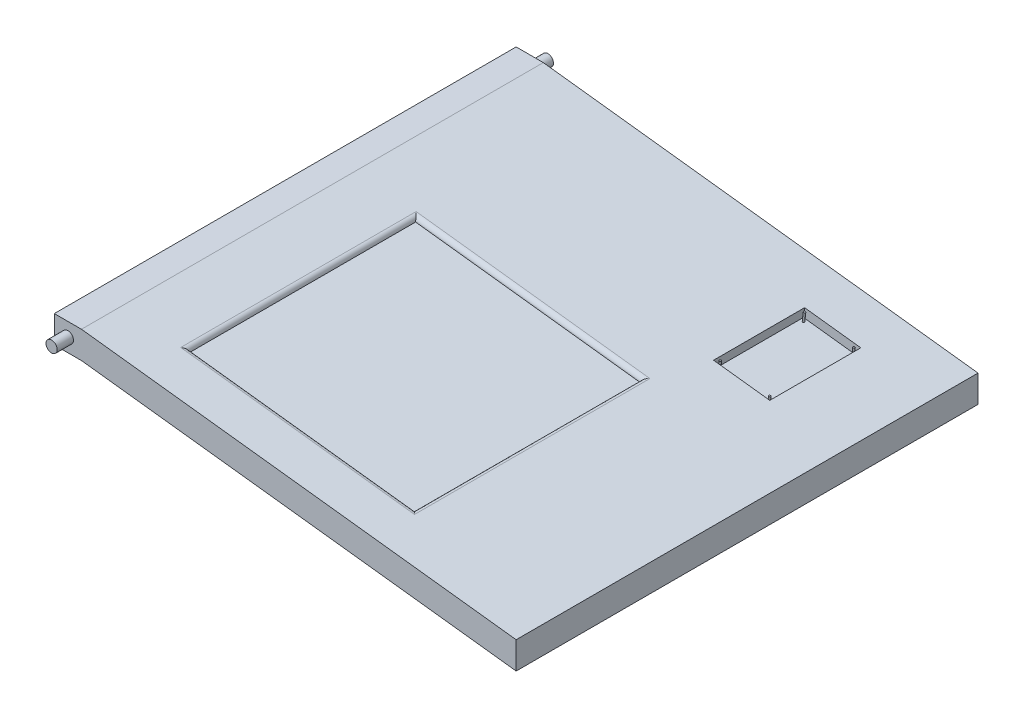
ISO-10303-21;
HEADER;
FILE_DESCRIPTION(('STEP AP214'),'2;1');
FILE_NAME('part.step','',(''),(''),'','','');
FILE_SCHEMA(('AUTOMOTIVE_DESIGN { 1 0 10303 214 1 1 1 1 }'));
ENDSEC;
DATA;
#1=APPLICATION_CONTEXT('core data for automotive mechanical design processes');
#2=APPLICATION_PROTOCOL_DEFINITION('international standard','automotive_design',2000,#1);
#3=PRODUCT_CONTEXT('',#1,'mechanical');
#4=PRODUCT('Part','Part','',(#3));
#5=PRODUCT_RELATED_PRODUCT_CATEGORY('part','',(#4));
#6=PRODUCT_DEFINITION_FORMATION('','',#4);
#7=PRODUCT_DEFINITION_CONTEXT('part definition',#1,'design');
#8=PRODUCT_DEFINITION('design','',#6,#7);
#9=PRODUCT_DEFINITION_SHAPE('','',#8);
#10=(LENGTH_UNIT() NAMED_UNIT(*) SI_UNIT(.MILLI.,.METRE.));
#11=(NAMED_UNIT(*) PLANE_ANGLE_UNIT() SI_UNIT($,.RADIAN.));
#12=(NAMED_UNIT(*) SI_UNIT($,.STERADIAN.) SOLID_ANGLE_UNIT());
#13=UNCERTAINTY_MEASURE_WITH_UNIT(LENGTH_MEASURE(1.E-05),#10,'distance_accuracy_value','');
#14=(GEOMETRIC_REPRESENTATION_CONTEXT(3) GLOBAL_UNCERTAINTY_ASSIGNED_CONTEXT((#13)) GLOBAL_UNIT_ASSIGNED_CONTEXT((#10,
#11,#12)) REPRESENTATION_CONTEXT('',''));
#15=CARTESIAN_POINT('',(0.,0.,0.));
#16=DIRECTION('',(0.,0.,1.));
#17=DIRECTION('',(1.,0.,0.));
#18=AXIS2_PLACEMENT_3D('',#15,#16,#17);
#19=CARTESIAN_POINT('',(-50.6671987968214,85.1607173842718,-20.));
#20=DIRECTION('',(0.,0.,1.));
#21=DIRECTION('',(1.,0.,0.));
#22=AXIS2_PLACEMENT_3D('',#19,#20,#21);
#23=CYLINDRICAL_SURFACE('',#22,6.18185615396312);
#24=CARTESIAN_POINT('',(-50.6671987968214,85.1607173842718,-20.));
#25=DIRECTION('',(0.,0.,-1.));
#26=DIRECTION('',(-1.,0.,0.));
#27=AXIS2_PLACEMENT_3D('',#24,#25,#26);
#28=CIRCLE('',#27,6.18185615396312);
#29=CARTESIAN_POINT('',(-56.8490549507845,85.1607173842718,-20.));
#30=VERTEX_POINT('',#29);
#31=EDGE_CURVE('E11',#30,#30,#28,.T.);
#32=ORIENTED_EDGE('',*,*,#31,.F.);
#33=EDGE_LOOP('',(#32));
#34=FACE_BOUND('',#33,.T.);
#35=CARTESIAN_POINT('',(-50.6671987968214,85.1607173842718,0.));
#36=DIRECTION('',(0.,0.,-1.));
#37=DIRECTION('',(-1.,0.,0.));
#38=AXIS2_PLACEMENT_3D('',#35,#36,#37);
#39=CIRCLE('',#38,6.18185615396312);
#40=CARTESIAN_POINT('',(-56.8490549507845,85.1607173842718,0.));
#41=VERTEX_POINT('',#40);
#42=EDGE_CURVE('E45',#41,#41,#39,.T.);
#43=ORIENTED_EDGE('',*,*,#42,.T.);
#44=EDGE_LOOP('',(#43));
#45=FACE_BOUND('',#44,.T.);
#46=ADVANCED_FACE('F42',(#34,#45),#23,.T.);
#47=CARTESIAN_POINT('',(-50.6671987968214,85.1607173842718,-20.));
#48=DIRECTION('',(0.,0.,-1.));
#49=DIRECTION('',(-1.,0.,0.));
#50=AXIS2_PLACEMENT_3D('',#47,#48,#49);
#51=PLANE('',#50);
#52=ORIENTED_EDGE('',*,*,#31,.T.);
#53=EDGE_LOOP('',(#52));
#54=FACE_BOUND('',#53,.T.);
#55=ADVANCED_FACE('F57',(#54),#51,.T.);
#56=CARTESIAN_POINT('',(-50.6671987968214,85.1607173842718,0.));
#57=DIRECTION('',(0.,0.,-1.));
#58=DIRECTION('',(-1.,0.,0.));
#59=AXIS2_PLACEMENT_3D('',#56,#57,#58);
#60=PLANE('',#59);
#61=ORIENTED_EDGE('',*,*,#42,.F.);
#62=EDGE_LOOP('',(#61));
#63=FACE_BOUND('',#62,.T.);
#64=ADVANCED_FACE('F55',(#63),#60,.F.);
#65=CLOSED_SHELL('',(#46,#55,#64));
#66=MANIFOLD_SOLID_BREP('B2',#65);
#67=CARTESIAN_POINT('',(-50.6671987968214,85.1607173842718,510.));
#68=DIRECTION('',(0.,0.,-1.));
#69=DIRECTION('',(-1.,0.,0.));
#70=AXIS2_PLACEMENT_3D('',#67,#68,#69);
#71=CYLINDRICAL_SURFACE('',#70,6.18185615396314);
#72=CARTESIAN_POINT('',(-50.6671987968214,85.1607173842718,0.));
#73=DIRECTION('',(0.,0.,1.));
#74=DIRECTION('',(1.,0.,0.));
#75=AXIS2_PLACEMENT_3D('',#72,#73,#74);
#76=CIRCLE('',#75,6.18185615396314);
#77=CARTESIAN_POINT('',(-44.4853426428583,85.1607173842718,0.));
#78=VERTEX_POINT('',#77);
#79=EDGE_CURVE('E291',#78,#78,#76,.T.);
#80=ORIENTED_EDGE('',*,*,#79,.F.);
#81=EDGE_LOOP('',(#80));
#82=FACE_BOUND('',#81,.T.);
#83=CARTESIAN_POINT('',(-50.6671987968214,85.1607173842718,39.));
#84=DIRECTION('',(0.,0.,1.));
#85=DIRECTION('',(1.,0.,0.));
#86=AXIS2_PLACEMENT_3D('',#83,#84,#85);
#87=CIRCLE('',#86,6.18185615396313);
#88=CARTESIAN_POINT('',(-44.4853426428583,85.1607173842718,39.));
#89=VERTEX_POINT('',#88);
#90=EDGE_CURVE('E279',#89,#89,#87,.T.);
#91=ORIENTED_EDGE('',*,*,#90,.T.);
#92=EDGE_LOOP('',(#91));
#93=FACE_BOUND('',#92,.T.);
#94=ADVANCED_FACE('F82',(#82,#93),#71,.F.);
#95=CARTESIAN_POINT('',(0.,0.,510.));
#96=DIRECTION('',(0.,0.,1.));
#97=DIRECTION('',(1.,0.,0.));
#98=AXIS2_PLACEMENT_3D('',#95,#96,#97);
#99=PLANE('',#98);
#100=DIRECTION('',(-1.,0.,0.));
#101=VECTOR('',#100,1.);
#102=CARTESIAN_POINT('',(-35.6671987968214,100.160717384272,510.));
#103=LINE('',#102,#101);
#104=CARTESIAN_POINT('',(-35.6671987968214,100.160717384272,510.));
#105=VERTEX_POINT('',#104);
#106=CARTESIAN_POINT('',(-65.6671987968214,100.160717384272,510.));
#107=VERTEX_POINT('',#106);
#108=EDGE_CURVE('E298',#105,#107,#103,.T.);
#109=ORIENTED_EDGE('',*,*,#108,.T.);
#110=DIRECTION('',(0.,-1.,0.));
#111=VECTOR('',#110,1.);
#112=CARTESIAN_POINT('',(-65.6671987968214,100.160717384272,510.));
#113=LINE('',#112,#111);
#114=CARTESIAN_POINT('',(-65.6671987968214,70.1607173842718,510.));
#115=VERTEX_POINT('',#114);
#116=EDGE_CURVE('E301',#107,#115,#113,.T.);
#117=ORIENTED_EDGE('',*,*,#116,.T.);
#118=DIRECTION('',(1.,0.,0.));
#119=VECTOR('',#118,1.);
#120=CARTESIAN_POINT('',(-65.6671987968214,70.1607173842718,510.));
#121=LINE('',#120,#119);
#122=CARTESIAN_POINT('',(-35.6671987968214,70.1607173842718,510.));
#123=VERTEX_POINT('',#122);
#124=EDGE_CURVE('E304',#115,#123,#121,.T.);
#125=ORIENTED_EDGE('',*,*,#124,.T.);
#126=DIRECTION('',(0.993047201905513,-0.117716841563267,0.));
#127=VECTOR('',#126,1.);
#128=CARTESIAN_POINT('',(-35.6671987968214,70.1607173842718,510.));
#129=LINE('',#128,#127);
#130=CARTESIAN_POINT('',(444.332801203179,13.2610213356398,510.));
#131=VERTEX_POINT('',#130);
#132=EDGE_CURVE('E306',#123,#131,#129,.T.);
#133=ORIENTED_EDGE('',*,*,#132,.T.);
#134=DIRECTION('',(0.,1.,0.));
#135=VECTOR('',#134,1.);
#136=CARTESIAN_POINT('',(444.332801203179,13.2610213356398,510.));
#137=LINE('',#136,#135);
#138=CARTESIAN_POINT('',(444.332801203179,43.2610213356398,510.));
#139=VERTEX_POINT('',#138);
#140=EDGE_CURVE('E308',#131,#139,#137,.T.);
#141=ORIENTED_EDGE('',*,*,#140,.T.);
#142=DIRECTION('',(-0.993047201905513,0.117716841563267,0.));
#143=VECTOR('',#142,1.);
#144=CARTESIAN_POINT('',(444.332801203179,43.2610213356398,510.));
#145=LINE('',#144,#143);
#146=EDGE_CURVE('E310',#139,#105,#145,.T.);
#147=ORIENTED_EDGE('',*,*,#146,.T.);
#148=EDGE_LOOP('',(#109,#117,#125,#133,#141,#147));
#149=FACE_BOUND('',#148,.T.);
#150=CARTESIAN_POINT('',(-50.6671987968214,85.1607173842718,510.));
#151=DIRECTION('',(0.,0.,1.));
#152=DIRECTION('',(1.,0.,0.));
#153=AXIS2_PLACEMENT_3D('',#150,#151,#152);
#154=CIRCLE('',#153,6.18185615396314);
#155=CARTESIAN_POINT('',(-44.4853426428583,85.1607173842718,510.));
#156=VERTEX_POINT('',#155);
#157=EDGE_CURVE('E292',#156,#156,#154,.T.);
#158=ORIENTED_EDGE('',*,*,#157,.F.);
#159=EDGE_LOOP('',(#158));
#160=FACE_BOUND('',#159,.T.);
#161=ADVANCED_FACE('F390',(#149,#160),#99,.T.);
#162=CARTESIAN_POINT('',(0.,0.,0.));
#163=DIRECTION('',(0.,0.,1.));
#164=DIRECTION('',(1.,0.,0.));
#165=AXIS2_PLACEMENT_3D('',#162,#163,#164);
#166=PLANE('',#165);
#167=DIRECTION('',(-1.,0.,0.));
#168=VECTOR('',#167,1.);
#169=CARTESIAN_POINT('',(-35.6671987968214,100.160717384272,0.));
#170=LINE('',#169,#168);
#171=CARTESIAN_POINT('',(-35.6671987968214,100.160717384272,0.));
#172=VERTEX_POINT('',#171);
#173=CARTESIAN_POINT('',(-65.6671987968214,100.160717384272,0.));
#174=VERTEX_POINT('',#173);
#175=EDGE_CURVE('E295',#172,#174,#170,.T.);
#176=ORIENTED_EDGE('',*,*,#175,.F.);
#177=DIRECTION('',(-0.993047201905513,0.117716841563267,0.));
#178=VECTOR('',#177,1.);
#179=CARTESIAN_POINT('',(444.332801203179,43.2610213356398,0.));
#180=LINE('',#179,#178);
#181=CARTESIAN_POINT('',(444.332801203179,43.2610213356398,0.));
#182=VERTEX_POINT('',#181);
#183=EDGE_CURVE('E302',#182,#172,#180,.T.);
#184=ORIENTED_EDGE('',*,*,#183,.F.);
#185=DIRECTION('',(0.,1.,0.));
#186=VECTOR('',#185,1.);
#187=CARTESIAN_POINT('',(444.332801203179,13.2610213356398,0.));
#188=LINE('',#187,#186);
#189=CARTESIAN_POINT('',(444.332801203179,13.2610213356398,0.));
#190=VERTEX_POINT('',#189);
#191=EDGE_CURVE('E321',#190,#182,#188,.T.);
#192=ORIENTED_EDGE('',*,*,#191,.F.);
#193=DIRECTION('',(0.993047201905513,-0.117716841563267,0.));
#194=VECTOR('',#193,1.);
#195=CARTESIAN_POINT('',(-35.6671987968214,70.1607173842718,0.));
#196=LINE('',#195,#194);
#197=CARTESIAN_POINT('',(-35.6671987968214,70.1607173842718,0.));
#198=VERTEX_POINT('',#197);
#199=EDGE_CURVE('E319',#198,#190,#196,.T.);
#200=ORIENTED_EDGE('',*,*,#199,.F.);
#201=DIRECTION('',(1.,0.,0.));
#202=VECTOR('',#201,1.);
#203=CARTESIAN_POINT('',(-65.6671987968214,70.1607173842718,0.));
#204=LINE('',#203,#202);
#205=CARTESIAN_POINT('',(-65.6671987968214,70.1607173842718,0.));
#206=VERTEX_POINT('',#205);
#207=EDGE_CURVE('E317',#206,#198,#204,.T.);
#208=ORIENTED_EDGE('',*,*,#207,.F.);
#209=DIRECTION('',(0.,-1.,0.));
#210=VECTOR('',#209,1.);
#211=CARTESIAN_POINT('',(-65.6671987968214,100.160717384272,0.));
#212=LINE('',#211,#210);
#213=EDGE_CURVE('E315',#174,#206,#212,.T.);
#214=ORIENTED_EDGE('',*,*,#213,.F.);
#215=EDGE_LOOP('',(#176,#184,#192,#200,#208,#214));
#216=FACE_BOUND('',#215,.T.);
#217=ORIENTED_EDGE('',*,*,#79,.T.);
#218=EDGE_LOOP('',(#217));
#219=FACE_BOUND('',#218,.T.);
#220=ADVANCED_FACE('F396',(#216,#219),#166,.F.);
#221=CARTESIAN_POINT('',(-35.6671987968214,100.160717384272,510.));
#222=DIRECTION('',(0.,-1.,0.));
#223=DIRECTION('',(0.,0.,-1.));
#224=AXIS2_PLACEMENT_3D('',#221,#222,#223);
#225=PLANE('',#224);
#226=ORIENTED_EDGE('',*,*,#175,.T.);
#227=DIRECTION('',(0.,0.,-1.));
#228=VECTOR('',#227,1.);
#229=CARTESIAN_POINT('',(-65.6671987968214,100.160717384272,510.));
#230=LINE('',#229,#228);
#231=EDGE_CURVE('E338',#107,#174,#230,.T.);
#232=ORIENTED_EDGE('',*,*,#231,.F.);
#233=ORIENTED_EDGE('',*,*,#108,.F.);
#234=DIRECTION('',(0.,0.,-1.));
#235=VECTOR('',#234,1.);
#236=CARTESIAN_POINT('',(-35.6671987968214,100.160717384272,510.));
#237=LINE('',#236,#235);
#238=EDGE_CURVE('E312',#105,#172,#237,.T.);
#239=ORIENTED_EDGE('',*,*,#238,.T.);
#240=EDGE_LOOP('',(#226,#232,#233,#239));
#241=FACE_BOUND('',#240,.T.);
#242=ADVANCED_FACE('F406',(#241),#225,.F.);
#243=CARTESIAN_POINT('',(-65.6671987968214,100.160717384272,510.));
#244=DIRECTION('',(1.,0.,0.));
#245=DIRECTION('',(0.,0.,-1.));
#246=AXIS2_PLACEMENT_3D('',#243,#244,#245);
#247=PLANE('',#246);
#248=ORIENTED_EDGE('',*,*,#213,.T.);
#249=DIRECTION('',(0.,0.,-1.));
#250=VECTOR('',#249,1.);
#251=CARTESIAN_POINT('',(-65.6671987968214,70.1607173842718,510.));
#252=LINE('',#251,#250);
#253=EDGE_CURVE('E335',#115,#206,#252,.T.);
#254=ORIENTED_EDGE('',*,*,#253,.F.);
#255=ORIENTED_EDGE('',*,*,#116,.F.);
#256=ORIENTED_EDGE('',*,*,#231,.T.);
#257=EDGE_LOOP('',(#248,#254,#255,#256));
#258=FACE_BOUND('',#257,.T.);
#259=ADVANCED_FACE('F422',(#258),#247,.F.);
#260=CARTESIAN_POINT('',(-65.6671987968214,70.1607173842718,510.));
#261=DIRECTION('',(0.,1.,0.));
#262=DIRECTION('',(0.,0.,1.));
#263=AXIS2_PLACEMENT_3D('',#260,#261,#262);
#264=PLANE('',#263);
#265=ORIENTED_EDGE('',*,*,#207,.T.);
#266=DIRECTION('',(0.,0.,-1.));
#267=VECTOR('',#266,1.);
#268=CARTESIAN_POINT('',(-35.6671987968214,70.1607173842718,510.));
#269=LINE('',#268,#267);
#270=EDGE_CURVE('E332',#123,#198,#269,.T.);
#271=ORIENTED_EDGE('',*,*,#270,.F.);
#272=ORIENTED_EDGE('',*,*,#124,.F.);
#273=ORIENTED_EDGE('',*,*,#253,.T.);
#274=EDGE_LOOP('',(#265,#271,#272,#273));
#275=FACE_BOUND('',#274,.T.);
#276=ADVANCED_FACE('F418',(#275),#264,.F.);
#277=CARTESIAN_POINT('',(-35.6671987968214,70.1607173842718,510.));
#278=DIRECTION('',(0.117716841563267,0.993047201905513,0.));
#279=DIRECTION('',(-0.993047201905513,0.117716841563267,0.));
#280=AXIS2_PLACEMENT_3D('',#277,#278,#279);
#281=PLANE('',#280);
#282=ORIENTED_EDGE('',*,*,#199,.T.);
#283=DIRECTION('',(0.,0.,-1.));
#284=VECTOR('',#283,1.);
#285=CARTESIAN_POINT('',(444.332801203179,13.2610213356398,510.));
#286=LINE('',#285,#284);
#287=EDGE_CURVE('E329',#131,#190,#286,.T.);
#288=ORIENTED_EDGE('',*,*,#287,.F.);
#289=ORIENTED_EDGE('',*,*,#132,.F.);
#290=ORIENTED_EDGE('',*,*,#270,.T.);
#291=EDGE_LOOP('',(#282,#288,#289,#290));
#292=FACE_BOUND('',#291,.T.);
#293=ADVANCED_FACE('F414',(#292),#281,.F.);
#294=CARTESIAN_POINT('',(444.332801203179,13.2610213356398,510.));
#295=DIRECTION('',(-1.,0.,0.));
#296=DIRECTION('',(0.,-1.,0.));
#297=AXIS2_PLACEMENT_3D('',#294,#295,#296);
#298=PLANE('',#297);
#299=ORIENTED_EDGE('',*,*,#191,.T.);
#300=DIRECTION('',(0.,0.,-1.));
#301=VECTOR('',#300,1.);
#302=CARTESIAN_POINT('',(444.332801203179,43.2610213356398,510.));
#303=LINE('',#302,#301);
#304=EDGE_CURVE('E326',#139,#182,#303,.T.);
#305=ORIENTED_EDGE('',*,*,#304,.F.);
#306=ORIENTED_EDGE('',*,*,#140,.F.);
#307=ORIENTED_EDGE('',*,*,#287,.T.);
#308=EDGE_LOOP('',(#299,#305,#306,#307));
#309=FACE_BOUND('',#308,.T.);
#310=ADVANCED_FACE('F411',(#309),#298,.F.);
#311=CARTESIAN_POINT('',(444.332801203179,43.2610213356398,510.));
#312=DIRECTION('',(-0.117716841563267,-0.993047201905513,0.));
#313=DIRECTION('',(0.993047201905513,-0.117716841563267,0.));
#314=AXIS2_PLACEMENT_3D('',#311,#312,#313);
#315=PLANE('',#314);
#316=DIRECTION('',(-0.993047201905513,0.117716841563267,0.));
#317=VECTOR('',#316,1.);
#318=CARTESIAN_POINT('',(444.332801203179,43.2610213356398,205.));
#319=LINE('',#318,#317);
#320=CARTESIAN_POINT('',(28.8808693270369,92.5091226826595,205.));
#321=VERTEX_POINT('',#320);
#322=CARTESIAN_POINT('',(287.07314182247,61.90274387621,205.));
#323=VERTEX_POINT('',#322);
#324=EDGE_CURVE('E344',#321,#323,#319,.F.);
#325=ORIENTED_EDGE('',*,*,#324,.T.);
#326=DIRECTION('',(0.,0.,-1.));
#327=VECTOR('',#326,1.);
#328=CARTESIAN_POINT('',(287.07314182247,61.90274387621,510.));
#329=LINE('',#328,#327);
#330=CARTESIAN_POINT('',(287.07314182247,61.90274387621,465.));
#331=VERTEX_POINT('',#330);
#332=EDGE_CURVE('E350',#323,#331,#329,.F.);
#333=ORIENTED_EDGE('',*,*,#332,.T.);
#334=DIRECTION('',(0.993047201905513,-0.117716841563267,0.));
#335=VECTOR('',#334,1.);
#336=CARTESIAN_POINT('',(444.332801203179,43.2610213356398,465.));
#337=LINE('',#336,#335);
#338=CARTESIAN_POINT('',(28.880869327037,92.5091226826595,465.));
#339=VERTEX_POINT('',#338);
#340=EDGE_CURVE('E348',#331,#339,#337,.F.);
#341=ORIENTED_EDGE('',*,*,#340,.T.);
#342=DIRECTION('',(0.,0.,1.));
#343=VECTOR('',#342,1.);
#344=CARTESIAN_POINT('',(28.880869327037,92.5091226826595,510.));
#345=LINE('',#344,#343);
#346=EDGE_CURVE('E346',#339,#321,#345,.F.);
#347=ORIENTED_EDGE('',*,*,#346,.T.);
#348=EDGE_LOOP('',(#325,#333,#341,#347));
#349=FACE_BOUND('',#348,.T.);
#350=DIRECTION('',(0.993047201905513,-0.117716841563267,0.));
#351=VECTOR('',#350,1.);
#352=CARTESIAN_POINT('',(302.823574931643,60.0356712584054,150.5));
#353=LINE('',#352,#351);
#354=CARTESIAN_POINT('',(302.823574931643,60.0356712584054,150.5));
#355=VERTEX_POINT('',#354);
#356=CARTESIAN_POINT('',(364.889025050738,52.6783686607012,150.5));
#357=VERTEX_POINT('',#356);
#358=EDGE_CURVE('E269',#355,#357,#353,.T.);
#359=ORIENTED_EDGE('',*,*,#358,.F.);
#360=DIRECTION('',(0.,0.,1.));
#361=VECTOR('',#360,1.);
#362=CARTESIAN_POINT('',(302.823574931643,60.0356712584054,150.5));
#363=LINE('',#362,#361);
#364=CARTESIAN_POINT('',(302.823574931643,60.0356712584054,50.));
#365=VERTEX_POINT('',#364);
#366=EDGE_CURVE('E251',#365,#355,#363,.T.);
#367=ORIENTED_EDGE('',*,*,#366,.F.);
#368=DIRECTION('',(-0.993047201905513,0.117716841563267,0.));
#369=VECTOR('',#368,1.);
#370=CARTESIAN_POINT('',(302.823574931643,60.0356712584054,50.));
#371=LINE('',#370,#369);
#372=CARTESIAN_POINT('',(364.889025050738,52.6783686607012,50.));
#373=VERTEX_POINT('',#372);
#374=EDGE_CURVE('E258',#373,#365,#371,.T.);
#375=ORIENTED_EDGE('',*,*,#374,.F.);
#376=DIRECTION('',(0.,0.,-1.));
#377=VECTOR('',#376,1.);
#378=CARTESIAN_POINT('',(364.889025050738,52.6783686607012,150.5));
#379=LINE('',#378,#377);
#380=EDGE_CURVE('E272',#357,#373,#379,.T.);
#381=ORIENTED_EDGE('',*,*,#380,.F.);
#382=EDGE_LOOP('',(#359,#367,#375,#381));
#383=FACE_BOUND('',#382,.T.);
#384=ORIENTED_EDGE('',*,*,#183,.T.);
#385=ORIENTED_EDGE('',*,*,#238,.F.);
#386=ORIENTED_EDGE('',*,*,#146,.F.);
#387=ORIENTED_EDGE('',*,*,#304,.T.);
#388=EDGE_LOOP('',(#384,#385,#386,#387));
#389=FACE_BOUND('',#388,.T.);
#390=ADVANCED_FACE('F377',(#349,#383,#389),#315,.F.);
#391=CARTESIAN_POINT('',(-50.6671987968214,85.1607173842718,39.));
#392=DIRECTION('',(0.,0.,1.));
#393=DIRECTION('',(1.,0.,0.));
#394=AXIS2_PLACEMENT_3D('',#391,#392,#393);
#395=PLANE('',#394);
#396=ORIENTED_EDGE('',*,*,#90,.F.);
#397=EDGE_LOOP('',(#396));
#398=FACE_BOUND('',#397,.T.);
#399=ADVANCED_FACE('F410',(#398),#395,.F.);
#400=CARTESIAN_POINT('',(-50.6671987968214,85.1607173842718,528.));
#401=DIRECTION('',(0.,0.,-1.));
#402=DIRECTION('',(-1.,0.,0.));
#403=AXIS2_PLACEMENT_3D('',#400,#401,#402);
#404=CYLINDRICAL_SURFACE('',#403,6.18185615396313);
#405=ORIENTED_EDGE('',*,*,#157,.T.);
#406=EDGE_LOOP('',(#405));
#407=FACE_BOUND('',#406,.T.);
#408=CARTESIAN_POINT('',(-50.6671987968214,85.1607173842718,528.));
#409=DIRECTION('',(0.,0.,1.));
#410=DIRECTION('',(1.,0.,0.));
#411=AXIS2_PLACEMENT_3D('',#408,#409,#410);
#412=CIRCLE('',#411,6.18185615396313);
#413=CARTESIAN_POINT('',(-44.4853426428583,85.1607173842718,528.));
#414=VERTEX_POINT('',#413);
#415=EDGE_CURVE('E288',#414,#414,#412,.T.);
#416=ORIENTED_EDGE('',*,*,#415,.F.);
#417=EDGE_LOOP('',(#416));
#418=FACE_BOUND('',#417,.T.);
#419=ADVANCED_FACE('F402',(#407,#418),#404,.T.);
#420=CARTESIAN_POINT('',(-50.6671987968214,85.1607173842718,528.));
#421=DIRECTION('',(0.,0.,1.));
#422=DIRECTION('',(1.,0.,0.));
#423=AXIS2_PLACEMENT_3D('',#420,#421,#422);
#424=PLANE('',#423);
#425=ORIENTED_EDGE('',*,*,#415,.T.);
#426=EDGE_LOOP('',(#425));
#427=FACE_BOUND('',#426,.T.);
#428=ADVANCED_FACE('F589',(#427),#424,.T.);
#429=CARTESIAN_POINT('',(301.64640651601,50.1051992393502,150.5));
#430=DIRECTION('',(-0.993047201905513,0.117716841563267,0.));
#431=DIRECTION('',(-0.117716841563267,-0.993047201905513,0.));
#432=AXIS2_PLACEMENT_3D('',#429,#430,#431);
#433=PLANE('',#432);
#434=ORIENTED_EDGE('',*,*,#366,.T.);
#435=DIRECTION('',(0.117716841563267,0.993047201905513,0.));
#436=VECTOR('',#435,1.);
#437=CARTESIAN_POINT('',(301.64640651601,50.1051992393502,150.5));
#438=LINE('',#437,#436);
#439=CARTESIAN_POINT('',(301.64640651601,50.1051992393502,150.5));
#440=VERTEX_POINT('',#439);
#441=EDGE_CURVE('E267',#440,#355,#438,.T.);
#442=ORIENTED_EDGE('',*,*,#441,.F.);
#443=DIRECTION('',(0.,0.,1.));
#444=VECTOR('',#443,1.);
#445=CARTESIAN_POINT('',(301.64640651601,50.1051992393502,150.5));
#446=LINE('',#445,#444);
#447=CARTESIAN_POINT('',(301.64640651601,50.1051992393502,50.));
#448=VERTEX_POINT('',#447);
#449=EDGE_CURVE('E254',#448,#440,#446,.T.);
#450=ORIENTED_EDGE('',*,*,#449,.F.);
#451=DIRECTION('',(0.117716841563267,0.993047201905513,0.));
#452=VECTOR('',#451,1.);
#453=CARTESIAN_POINT('',(301.64640651601,50.1051992393502,50.));
#454=LINE('',#453,#452);
#455=EDGE_CURVE('E277',#448,#365,#454,.T.);
#456=ORIENTED_EDGE('',*,*,#455,.T.);
#457=EDGE_LOOP('',(#434,#442,#450,#456));
#458=FACE_BOUND('',#457,.T.);
#459=ADVANCED_FACE('F580',(#458),#433,.F.);
#460=CARTESIAN_POINT('',(301.64640651601,50.1051992393502,50.));
#461=DIRECTION('',(0.,0.,-1.));
#462=DIRECTION('',(-1.,0.,0.));
#463=AXIS2_PLACEMENT_3D('',#460,#461,#462);
#464=PLANE('',#463);
#465=ORIENTED_EDGE('',*,*,#374,.T.);
#466=ORIENTED_EDGE('',*,*,#455,.F.);
#467=DIRECTION('',(-0.993047201905513,0.117716841563267,0.));
#468=VECTOR('',#467,1.);
#469=CARTESIAN_POINT('',(301.64640651601,50.1051992393502,50.));
#470=LINE('',#469,#468);
#471=CARTESIAN_POINT('',(363.711856635105,42.7478966416461,50.));
#472=VERTEX_POINT('',#471);
#473=EDGE_CURVE('E264',#472,#448,#470,.T.);
#474=ORIENTED_EDGE('',*,*,#473,.F.);
#475=DIRECTION('',(0.117716841563267,0.993047201905513,0.));
#476=VECTOR('',#475,1.);
#477=CARTESIAN_POINT('',(363.711856635105,42.7478966416461,50.));
#478=LINE('',#477,#476);
#479=EDGE_CURVE('E280',#472,#373,#478,.T.);
#480=ORIENTED_EDGE('',*,*,#479,.T.);
#481=EDGE_LOOP('',(#465,#466,#474,#480));
#482=FACE_BOUND('',#481,.T.);
#483=ADVANCED_FACE('F571',(#482),#464,.F.);
#484=CARTESIAN_POINT('',(363.711856635105,42.7478966416461,150.5));
#485=DIRECTION('',(0.993047201905513,-0.117716841563267,0.));
#486=DIRECTION('',(0.117716841563267,0.993047201905513,0.));
#487=AXIS2_PLACEMENT_3D('',#484,#485,#486);
#488=PLANE('',#487);
#489=ORIENTED_EDGE('',*,*,#380,.T.);
#490=ORIENTED_EDGE('',*,*,#479,.F.);
#491=DIRECTION('',(0.,0.,-1.));
#492=VECTOR('',#491,1.);
#493=CARTESIAN_POINT('',(363.711856635105,42.7478966416461,150.5));
#494=LINE('',#493,#492);
#495=CARTESIAN_POINT('',(363.711856635105,42.7478966416461,150.5));
#496=VERTEX_POINT('',#495);
#497=EDGE_CURVE('E261',#496,#472,#494,.T.);
#498=ORIENTED_EDGE('',*,*,#497,.F.);
#499=DIRECTION('',(0.117716841563267,0.993047201905513,0.));
#500=VECTOR('',#499,1.);
#501=CARTESIAN_POINT('',(363.711856635105,42.7478966416461,150.5));
#502=LINE('',#501,#500);
#503=EDGE_CURVE('E282',#496,#357,#502,.T.);
#504=ORIENTED_EDGE('',*,*,#503,.T.);
#505=EDGE_LOOP('',(#489,#490,#498,#504));
#506=FACE_BOUND('',#505,.T.);
#507=ADVANCED_FACE('F562',(#506),#488,.F.);
#508=CARTESIAN_POINT('',(301.64640651601,50.1051992393502,150.5));
#509=DIRECTION('',(0.,0.,1.));
#510=DIRECTION('',(1.,0.,0.));
#511=AXIS2_PLACEMENT_3D('',#508,#509,#510);
#512=PLANE('',#511);
#513=ORIENTED_EDGE('',*,*,#358,.T.);
#514=ORIENTED_EDGE('',*,*,#503,.F.);
#515=DIRECTION('',(0.993047201905513,-0.117716841563267,0.));
#516=VECTOR('',#515,1.);
#517=CARTESIAN_POINT('',(301.64640651601,50.1051992393502,150.5));
#518=LINE('',#517,#516);
#519=EDGE_CURVE('E257',#440,#496,#518,.T.);
#520=ORIENTED_EDGE('',*,*,#519,.F.);
#521=ORIENTED_EDGE('',*,*,#441,.T.);
#522=EDGE_LOOP('',(#513,#514,#520,#521));
#523=FACE_BOUND('',#522,.T.);
#524=ADVANCED_FACE('F553',(#523),#512,.F.);
#525=CARTESIAN_POINT('',(10.0372077381147,84.6728550215324,0.));
#526=DIRECTION('',(-0.117716841563267,-0.993047201905513,0.));
#527=DIRECTION('',(0.993047201905513,-0.117716841563267,0.));
#528=AXIS2_PLACEMENT_3D('',#525,#526,#527);
#529=PLANE('',#528);
#530=CARTESIAN_POINT('',(305.370333523156,49.663761083488,146.75));
#531=DIRECTION('',(0.117716841563267,0.993047201905513,0.));
#532=DIRECTION('',(0.993047201905513,-0.117716841563267,0.));
#533=AXIS2_PLACEMENT_3D('',#530,#531,#532);
#534=CIRCLE('',#533,0.99999999999998);
#535=CARTESIAN_POINT('',(306.363380725062,49.5460442419247,146.75));
#536=VERTEX_POINT('',#535);
#537=EDGE_CURVE('E229',#536,#536,#534,.T.);
#538=ORIENTED_EDGE('',*,*,#537,.F.);
#539=EDGE_LOOP('',(#538));
#540=FACE_BOUND('',#539,.T.);
#541=CARTESIAN_POINT('',(359.987929627959,43.1893347975083,146.75));
#542=DIRECTION('',(0.117716841563267,0.993047201905513,0.));
#543=DIRECTION('',(-0.993047201905513,0.117716841563267,0.));
#544=AXIS2_PLACEMENT_3D('',#541,#542,#543);
#545=CIRCLE('',#544,0.999999999999979);
#546=CARTESIAN_POINT('',(358.994882426054,43.3070516390716,146.75));
#547=VERTEX_POINT('',#546);
#548=EDGE_CURVE('E236',#547,#547,#545,.T.);
#549=ORIENTED_EDGE('',*,*,#548,.F.);
#550=EDGE_LOOP('',(#549));
#551=FACE_BOUND('',#550,.T.);
#552=CARTESIAN_POINT('',(359.987929627959,43.1893347975083,53.75));
#553=DIRECTION('',(0.117716841563267,0.993047201905513,0.));
#554=DIRECTION('',(0.993047201905513,-0.117716841563267,0.));
#555=AXIS2_PLACEMENT_3D('',#552,#553,#554);
#556=CIRCLE('',#555,0.999999999999979);
#557=CARTESIAN_POINT('',(360.980976829865,43.071617955945,53.75));
#558=VERTEX_POINT('',#557);
#559=EDGE_CURVE('E242',#558,#558,#556,.T.);
#560=ORIENTED_EDGE('',*,*,#559,.F.);
#561=EDGE_LOOP('',(#560));
#562=FACE_BOUND('',#561,.T.);
#563=CARTESIAN_POINT('',(305.370333523156,49.663761083488,53.75));
#564=DIRECTION('',(0.117716841563267,0.993047201905513,0.));
#565=DIRECTION('',(-0.993047201905513,0.117716841563267,0.));
#566=AXIS2_PLACEMENT_3D('',#563,#564,#565);
#567=CIRCLE('',#566,0.99999999999998);
#568=CARTESIAN_POINT('',(304.377286321251,49.7814779250513,53.75));
#569=VERTEX_POINT('',#568);
#570=EDGE_CURVE('E248',#569,#569,#567,.T.);
#571=ORIENTED_EDGE('',*,*,#570,.F.);
#572=EDGE_LOOP('',(#571));
#573=FACE_BOUND('',#572,.T.);
#574=ORIENTED_EDGE('',*,*,#449,.T.);
#575=ORIENTED_EDGE('',*,*,#519,.T.);
#576=ORIENTED_EDGE('',*,*,#497,.T.);
#577=ORIENTED_EDGE('',*,*,#473,.T.);
#578=EDGE_LOOP('',(#574,#575,#576,#577));
#579=FACE_BOUND('',#578,.T.);
#580=ADVANCED_FACE('F544',(#540,#551,#562,#573,#579),#529,.F.);
#581=CARTESIAN_POINT('',(305.370333523156,49.663761083488,53.75));
#582=DIRECTION('',(0.117716841563267,0.993047201905513,0.));
#583=DIRECTION('',(-0.993047201905513,0.117716841563267,0.));
#584=AXIS2_PLACEMENT_3D('',#581,#582,#583);
#585=CYLINDRICAL_SURFACE('',#584,0.99999999999998);
#586=ORIENTED_EDGE('',*,*,#570,.T.);
#587=EDGE_LOOP('',(#586));
#588=FACE_BOUND('',#587,.T.);
#589=CARTESIAN_POINT('',(306.547501938789,59.5942331025431,53.75));
#590=DIRECTION('',(0.117716841563267,0.993047201905513,0.));
#591=DIRECTION('',(-0.993047201905513,0.117716841563267,0.));
#592=AXIS2_PLACEMENT_3D('',#589,#590,#591);
#593=CIRCLE('',#592,0.99999999999998);
#594=CARTESIAN_POINT('',(305.554454736883,59.7119499441064,53.75));
#595=VERTEX_POINT('',#594);
#596=EDGE_CURVE('E245',#595,#595,#593,.T.);
#597=ORIENTED_EDGE('',*,*,#596,.F.);
#598=EDGE_LOOP('',(#597));
#599=FACE_BOUND('',#598,.T.);
#600=ADVANCED_FACE('F535',(#588,#599),#585,.T.);
#601=CARTESIAN_POINT('',(359.987929627959,43.1893347975083,53.75));
#602=DIRECTION('',(0.117716841563267,0.993047201905513,0.));
#603=DIRECTION('',(-0.993047201905513,0.117716841563267,0.));
#604=AXIS2_PLACEMENT_3D('',#601,#602,#603);
#605=CYLINDRICAL_SURFACE('',#604,0.999999999999979);
#606=ORIENTED_EDGE('',*,*,#559,.T.);
#607=EDGE_LOOP('',(#606));
#608=FACE_BOUND('',#607,.T.);
#609=CARTESIAN_POINT('',(361.165098043592,53.1198068165634,53.75));
#610=DIRECTION('',(0.117716841563267,0.993047201905513,0.));
#611=DIRECTION('',(0.993047201905513,-0.117716841563267,0.));
#612=AXIS2_PLACEMENT_3D('',#609,#610,#611);
#613=CIRCLE('',#612,0.999999999999979);
#614=CARTESIAN_POINT('',(362.158145245498,53.0020899750002,53.75));
#615=VERTEX_POINT('',#614);
#616=EDGE_CURVE('E239',#615,#615,#613,.T.);
#617=ORIENTED_EDGE('',*,*,#616,.F.);
#618=EDGE_LOOP('',(#617));
#619=FACE_BOUND('',#618,.T.);
#620=ADVANCED_FACE('F526',(#608,#619),#605,.T.);
#621=CARTESIAN_POINT('',(359.987929627959,43.1893347975083,146.75));
#622=DIRECTION('',(0.117716841563267,0.993047201905513,0.));
#623=DIRECTION('',(-0.993047201905513,0.117716841563267,0.));
#624=AXIS2_PLACEMENT_3D('',#621,#622,#623);
#625=CYLINDRICAL_SURFACE('',#624,0.999999999999979);
#626=ORIENTED_EDGE('',*,*,#548,.T.);
#627=EDGE_LOOP('',(#626));
#628=FACE_BOUND('',#627,.T.);
#629=CARTESIAN_POINT('',(361.165098043592,53.1198068165634,146.75));
#630=DIRECTION('',(0.117716841563267,0.993047201905513,0.));
#631=DIRECTION('',(-0.993047201905513,0.117716841563267,0.));
#632=AXIS2_PLACEMENT_3D('',#629,#630,#631);
#633=CIRCLE('',#632,0.999999999999979);
#634=CARTESIAN_POINT('',(360.172050841687,53.2375236581267,146.75));
#635=VERTEX_POINT('',#634);
#636=EDGE_CURVE('E232',#635,#635,#633,.T.);
#637=ORIENTED_EDGE('',*,*,#636,.F.);
#638=EDGE_LOOP('',(#637));
#639=FACE_BOUND('',#638,.T.);
#640=ADVANCED_FACE('F516',(#628,#639),#625,.T.);
#641=CARTESIAN_POINT('',(305.370333523156,49.663761083488,146.75));
#642=DIRECTION('',(0.117716841563267,0.993047201905513,0.));
#643=DIRECTION('',(-0.993047201905513,0.117716841563267,0.));
#644=AXIS2_PLACEMENT_3D('',#641,#642,#643);
#645=CYLINDRICAL_SURFACE('',#644,0.99999999999998);
#646=ORIENTED_EDGE('',*,*,#537,.T.);
#647=EDGE_LOOP('',(#646));
#648=FACE_BOUND('',#647,.T.);
#649=CARTESIAN_POINT('',(306.547501938789,59.5942331025431,146.75));
#650=DIRECTION('',(0.117716841563267,0.993047201905513,0.));
#651=DIRECTION('',(0.993047201905513,-0.117716841563267,0.));
#652=AXIS2_PLACEMENT_3D('',#649,#650,#651);
#653=CIRCLE('',#652,0.99999999999998);
#654=CARTESIAN_POINT('',(307.540549140694,59.4765162609799,146.75));
#655=VERTEX_POINT('',#654);
#656=EDGE_CURVE('E233',#655,#655,#653,.T.);
#657=ORIENTED_EDGE('',*,*,#656,.F.);
#658=EDGE_LOOP('',(#657));
#659=FACE_BOUND('',#658,.T.);
#660=ADVANCED_FACE('F510',(#648,#659),#645,.T.);
#661=ORIENTED_EDGE('',*,*,#636,.T.);
#662=EDGE_LOOP('',(#661));
#663=FACE_BOUND('',#662,.T.);
#664=ADVANCED_FACE('F388',(#663),#315,.F.);
#665=ORIENTED_EDGE('',*,*,#616,.T.);
#666=EDGE_LOOP('',(#665));
#667=FACE_BOUND('',#666,.T.);
#668=ADVANCED_FACE('F599',(#667),#315,.F.);
#669=ORIENTED_EDGE('',*,*,#596,.T.);
#670=EDGE_LOOP('',(#669));
#671=FACE_BOUND('',#670,.T.);
#672=ADVANCED_FACE('F385',(#671),#315,.F.);
#673=ORIENTED_EDGE('',*,*,#656,.T.);
#674=EDGE_LOOP('',(#673));
#675=FACE_BOUND('',#674,.T.);
#676=ADVANCED_FACE('F380',(#675),#315,.F.);
#677=CARTESIAN_POINT('',(28.2922851192206,87.5438866731319,210.));
#678=DIRECTION('',(0.,0.,1.));
#679=DIRECTION('',(1.,0.,0.));
#680=AXIS2_PLACEMENT_3D('',#677,#678,#679);
#681=CYLINDRICAL_SURFACE('',#680,5.);
#682=CARTESIAN_POINT('',(28.2922851192206,87.5438866731319,205.));
#683=DIRECTION('',(-0.702190410505715,0.0832383769292486,0.707106781186548));
#684=DIRECTION('',(0.702190410505715,-0.0832383769292486,0.707106781186547));
#685=AXIS2_PLACEMENT_3D('',#682,#683,#684);
#686=ELLIPSE('',#685,7.07106781186548,5.);
#687=CARTESIAN_POINT('',(33.2575211287482,86.9553024653156,210.));
#688=VERTEX_POINT('',#687);
#689=EDGE_CURVE('E360',#321,#688,#686,.F.);
#690=ORIENTED_EDGE('',*,*,#689,.F.);
#691=ORIENTED_EDGE('',*,*,#346,.F.);
#692=CARTESIAN_POINT('',(28.2922851192206,87.5438866731319,465.));
#693=DIRECTION('',(0.702190410505715,-0.0832383769292487,0.707106781186547));
#694=DIRECTION('',(0.702190410505715,-0.0832383769292486,-0.707106781186547));
#695=AXIS2_PLACEMENT_3D('',#692,#693,#694);
#696=ELLIPSE('',#695,7.07106781186547,5.);
#697=CARTESIAN_POINT('',(33.2575211287482,86.9553024653156,460.));
#698=VERTEX_POINT('',#697);
#699=EDGE_CURVE('E86',#698,#339,#696,.T.);
#700=ORIENTED_EDGE('',*,*,#699,.F.);
#701=DIRECTION('',(0.,0.,1.));
#702=VECTOR('',#701,1.);
#703=CARTESIAN_POINT('',(33.2575211287482,86.9553024653156,210.));
#704=LINE('',#703,#702);
#705=EDGE_CURVE('E91',#688,#698,#704,.T.);
#706=ORIENTED_EDGE('',*,*,#705,.F.);
#707=EDGE_LOOP('',(#690,#691,#700,#706));
#708=FACE_BOUND('',#707,.T.);
#709=ADVANCED_FACE('F84',(#708),#681,.T.);
#710=CARTESIAN_POINT('',(33.2575211287482,86.9553024653156,465.));
#711=DIRECTION('',(0.993047201905513,-0.117716841563267,0.));
#712=DIRECTION('',(0.117716841563267,0.993047201905513,0.));
#713=AXIS2_PLACEMENT_3D('',#710,#711,#712);
#714=CYLINDRICAL_SURFACE('',#713,5.);
#715=ORIENTED_EDGE('',*,*,#699,.T.);
#716=ORIENTED_EDGE('',*,*,#340,.F.);
#717=CARTESIAN_POINT('',(286.484557614654,56.9375078666824,465.));
#718=DIRECTION('',(0.702190410505715,-0.0832383769292486,-0.707106781186548));
#719=DIRECTION('',(-0.702190410505715,0.0832383769292487,-0.707106781186547));
#720=AXIS2_PLACEMENT_3D('',#717,#718,#719);
#721=ELLIPSE('',#720,7.07106781186548,5.);
#722=CARTESIAN_POINT('',(281.519321605126,57.5260920744988,460.));
#723=VERTEX_POINT('',#722);
#724=EDGE_CURVE('E359',#723,#331,#721,.T.);
#725=ORIENTED_EDGE('',*,*,#724,.F.);
#726=DIRECTION('',(0.993047201905513,-0.117716841563267,0.));
#727=VECTOR('',#726,1.);
#728=CARTESIAN_POINT('',(33.2575211287482,86.9553024653156,460.));
#729=LINE('',#728,#727);
#730=EDGE_CURVE('E353',#698,#723,#729,.T.);
#731=ORIENTED_EDGE('',*,*,#730,.F.);
#732=EDGE_LOOP('',(#715,#716,#725,#731));
#733=FACE_BOUND('',#732,.T.);
#734=ADVANCED_FACE('F365',(#733),#714,.T.);
#735=CARTESIAN_POINT('',(33.2575211287482,86.9553024653156,205.));
#736=DIRECTION('',(-0.993047201905513,0.117716841563267,0.));
#737=DIRECTION('',(-0.117716841563267,-0.993047201905513,0.));
#738=AXIS2_PLACEMENT_3D('',#735,#736,#737);
#739=CYLINDRICAL_SURFACE('',#738,5.);
#740=ORIENTED_EDGE('',*,*,#689,.T.);
#741=DIRECTION('',(-0.993047201905513,0.117716841563267,0.));
#742=VECTOR('',#741,1.);
#743=CARTESIAN_POINT('',(33.2575211287482,86.9553024653156,210.));
#744=LINE('',#743,#742);
#745=CARTESIAN_POINT('',(281.519321605127,57.5260920744988,210.));
#746=VERTEX_POINT('',#745);
#747=EDGE_CURVE('E40',#746,#688,#744,.T.);
#748=ORIENTED_EDGE('',*,*,#747,.F.);
#749=CARTESIAN_POINT('',(286.484557614654,56.9375078666824,205.));
#750=DIRECTION('',(-0.702190410505715,0.0832383769292487,-0.707106781186547));
#751=DIRECTION('',(0.702190410505715,-0.0832383769292486,-0.707106781186548));
#752=AXIS2_PLACEMENT_3D('',#749,#750,#751);
#753=ELLIPSE('',#752,7.07106781186547,5.);
#754=EDGE_CURVE('E224',#323,#746,#753,.F.);
#755=ORIENTED_EDGE('',*,*,#754,.F.);
#756=ORIENTED_EDGE('',*,*,#324,.F.);
#757=EDGE_LOOP('',(#740,#748,#755,#756));
#758=FACE_BOUND('',#757,.T.);
#759=ADVANCED_FACE('F375',(#758),#739,.T.);
#760=CARTESIAN_POINT('',(286.484557614654,56.9375078666824,210.));
#761=DIRECTION('',(0.,0.,-1.));
#762=DIRECTION('',(-1.,0.,0.));
#763=AXIS2_PLACEMENT_3D('',#760,#761,#762);
#764=CYLINDRICAL_SURFACE('',#763,5.);
#765=ORIENTED_EDGE('',*,*,#724,.T.);
#766=ORIENTED_EDGE('',*,*,#332,.F.);
#767=ORIENTED_EDGE('',*,*,#754,.T.);
#768=DIRECTION('',(0.,0.,-1.));
#769=VECTOR('',#768,1.);
#770=CARTESIAN_POINT('',(281.519321605126,57.5260920744988,210.));
#771=LINE('',#770,#769);
#772=EDGE_CURVE('E341',#723,#746,#771,.T.);
#773=ORIENTED_EDGE('',*,*,#772,.F.);
#774=EDGE_LOOP('',(#765,#766,#767,#773));
#775=FACE_BOUND('',#774,.T.);
#776=ADVANCED_FACE('F372',(#775),#764,.T.);
#777=CARTESIAN_POINT('',(10.6503457888824,89.8452247318542,0.));
#778=DIRECTION('',(-0.117716841563267,-0.993047201905513,0.));
#779=DIRECTION('',(0.993047201905513,-0.117716841563267,0.));
#780=AXIS2_PLACEMENT_3D('',#777,#778,#779);
#781=PLANE('',#780);
#782=DIRECTION('',(0.,0.,-1.));
#783=VECTOR('',#782,1.);
#784=CARTESIAN_POINT('',(33.2820749716995,87.1624361661099,460.));
#785=LINE('',#784,#783);
#786=CARTESIAN_POINT('',(33.2820749716995,87.1624361661099,460.));
#787=VERTEX_POINT('',#786);
#788=CARTESIAN_POINT('',(33.2820749716995,87.1624361661099,210.));
#789=VERTEX_POINT('',#788);
#790=EDGE_CURVE('E211',#787,#789,#785,.T.);
#791=ORIENTED_EDGE('',*,*,#790,.F.);
#792=DIRECTION('',(-0.993047201905513,0.117716841563267,0.));
#793=VECTOR('',#792,1.);
#794=CARTESIAN_POINT('',(33.2820749716995,87.1624361661099,460.));
#795=LINE('',#794,#793);
#796=CARTESIAN_POINT('',(281.543875448078,57.7332257752931,460.));
#797=VERTEX_POINT('',#796);
#798=EDGE_CURVE('E204',#797,#787,#795,.T.);
#799=ORIENTED_EDGE('',*,*,#798,.F.);
#800=DIRECTION('',(0.,0.,1.));
#801=VECTOR('',#800,1.);
#802=CARTESIAN_POINT('',(281.543875448078,57.7332257752931,460.));
#803=LINE('',#802,#801);
#804=CARTESIAN_POINT('',(281.543875448078,57.7332257752931,210.));
#805=VERTEX_POINT('',#804);
#806=EDGE_CURVE('E214',#805,#797,#803,.T.);
#807=ORIENTED_EDGE('',*,*,#806,.F.);
#808=DIRECTION('',(0.993047201905513,-0.117716841563267,0.));
#809=VECTOR('',#808,1.);
#810=CARTESIAN_POINT('',(33.2820749716995,87.1624361661099,210.));
#811=LINE('',#810,#809);
#812=EDGE_CURVE('E200',#789,#805,#811,.T.);
#813=ORIENTED_EDGE('',*,*,#812,.F.);
#814=EDGE_LOOP('',(#791,#799,#807,#813));
#815=FACE_BOUND('',#814,.T.);
#816=ADVANCED_FACE('F209',(#815),#781,.F.);
#817=CARTESIAN_POINT('',(33.2820749716995,87.1624361661099,210.));
#818=DIRECTION('',(0.,0.,-1.));
#819=DIRECTION('',(-1.,0.,0.));
#820=AXIS2_PLACEMENT_3D('',#817,#818,#819);
#821=PLANE('',#820);
#822=ORIENTED_EDGE('',*,*,#747,.T.);
#823=DIRECTION('',(-0.117716841563267,-0.993047201905513,0.));
#824=VECTOR('',#823,1.);
#825=CARTESIAN_POINT('',(33.2820749716995,87.1624361661099,210.));
#826=LINE('',#825,#824);
#827=EDGE_CURVE('E196',#789,#688,#826,.T.);
#828=ORIENTED_EDGE('',*,*,#827,.F.);
#829=ORIENTED_EDGE('',*,*,#812,.T.);
#830=DIRECTION('',(-0.117716841563267,-0.993047201905513,0.));
#831=VECTOR('',#830,1.);
#832=CARTESIAN_POINT('',(281.543875448078,57.7332257752931,210.));
#833=LINE('',#832,#831);
#834=EDGE_CURVE('E203',#805,#746,#833,.T.);
#835=ORIENTED_EDGE('',*,*,#834,.T.);
#836=EDGE_LOOP('',(#822,#828,#829,#835));
#837=FACE_BOUND('',#836,.T.);
#838=ADVANCED_FACE('F198',(#837),#821,.T.);
#839=CARTESIAN_POINT('',(281.543875448078,57.7332257752931,460.));
#840=DIRECTION('',(0.993047201905513,-0.117716841563267,0.));
#841=DIRECTION('',(0.117716841563267,0.993047201905513,0.));
#842=AXIS2_PLACEMENT_3D('',#839,#840,#841);
#843=PLANE('',#842);
#844=ORIENTED_EDGE('',*,*,#772,.T.);
#845=ORIENTED_EDGE('',*,*,#834,.F.);
#846=ORIENTED_EDGE('',*,*,#806,.T.);
#847=DIRECTION('',(-0.117716841563267,-0.993047201905513,0.));
#848=VECTOR('',#847,1.);
#849=CARTESIAN_POINT('',(281.543875448078,57.7332257752931,460.));
#850=LINE('',#849,#848);
#851=EDGE_CURVE('E225',#797,#723,#850,.T.);
#852=ORIENTED_EDGE('',*,*,#851,.T.);
#853=EDGE_LOOP('',(#844,#845,#846,#852));
#854=FACE_BOUND('',#853,.T.);
#855=ADVANCED_FACE('F370',(#854),#843,.T.);
#856=CARTESIAN_POINT('',(33.2820749716995,87.1624361661099,460.));
#857=DIRECTION('',(0.,0.,1.));
#858=DIRECTION('',(1.,0.,0.));
#859=AXIS2_PLACEMENT_3D('',#856,#857,#858);
#860=PLANE('',#859);
#861=ORIENTED_EDGE('',*,*,#730,.T.);
#862=ORIENTED_EDGE('',*,*,#851,.F.);
#863=ORIENTED_EDGE('',*,*,#798,.T.);
#864=DIRECTION('',(-0.117716841563267,-0.993047201905513,0.));
#865=VECTOR('',#864,1.);
#866=CARTESIAN_POINT('',(33.2820749716995,87.1624361661099,460.));
#867=LINE('',#866,#865);
#868=EDGE_CURVE('E218',#787,#698,#867,.T.);
#869=ORIENTED_EDGE('',*,*,#868,.T.);
#870=EDGE_LOOP('',(#861,#862,#863,#869));
#871=FACE_BOUND('',#870,.T.);
#872=ADVANCED_FACE('F368',(#871),#860,.T.);
#873=CARTESIAN_POINT('',(33.2820749716995,87.1624361661099,460.));
#874=DIRECTION('',(-0.993047201905513,0.117716841563267,0.));
#875=DIRECTION('',(-0.117716841563267,-0.993047201905513,0.));
#876=AXIS2_PLACEMENT_3D('',#873,#874,#875);
#877=PLANE('',#876);
#878=ORIENTED_EDGE('',*,*,#705,.T.);
#879=ORIENTED_EDGE('',*,*,#868,.F.);
#880=ORIENTED_EDGE('',*,*,#790,.T.);
#881=ORIENTED_EDGE('',*,*,#827,.T.);
#882=EDGE_LOOP('',(#878,#879,#880,#881));
#883=FACE_BOUND('',#882,.T.);
#884=ADVANCED_FACE('F216',(#883),#877,.T.);
#885=CLOSED_SHELL('',(#94,#161,#220,#242,#259,#276,#293,#310,#390,#399,#419,#428,#459,#483,#507,
#524,#580,#600,#620,#640,#660,#664,#668,#672,#676,#709,#734,#759,#776,#816,#838,#855,#872,#884));
#886=MANIFOLD_SOLID_BREP('B6',#885);
#887=ADVANCED_BREP_SHAPE_REPRESENTATION('',(#18,#66,#886),#14);
#888=SHAPE_DEFINITION_REPRESENTATION(#9,#887);
ENDSEC;
END-ISO-10303-21;
